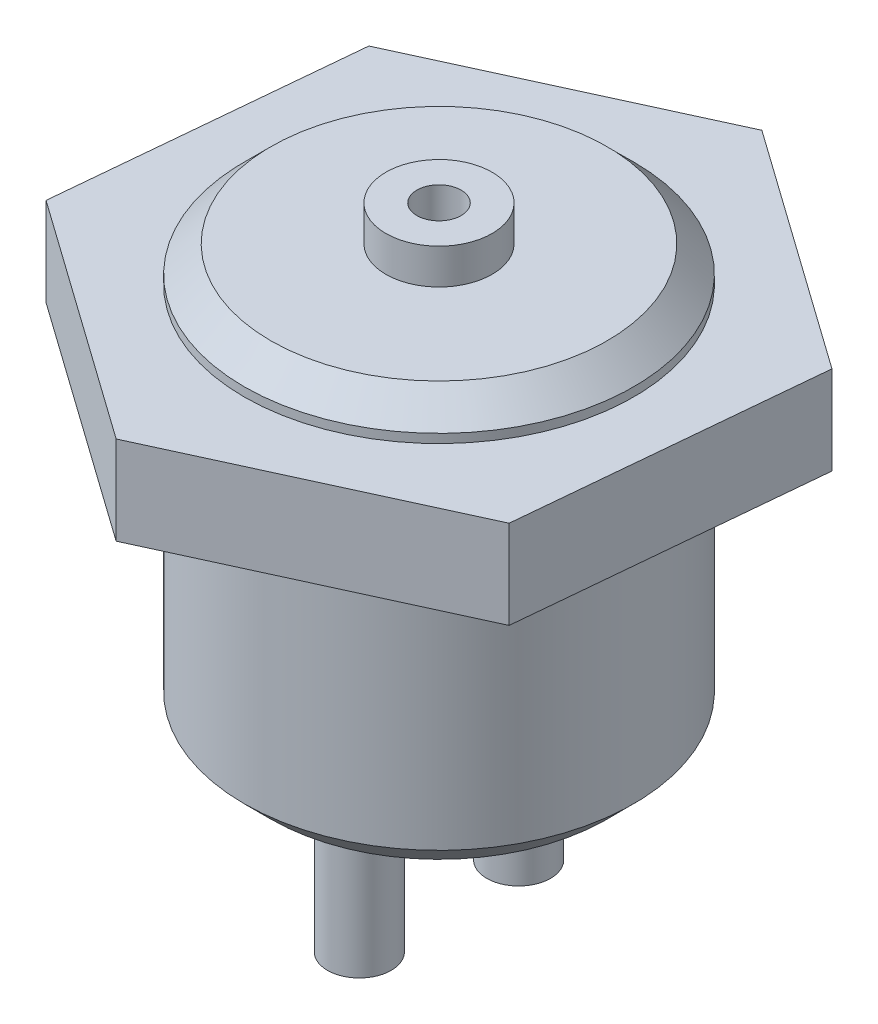
ISO-10303-21;
HEADER;
FILE_DESCRIPTION(('STEP AP214'),'2;1');
FILE_NAME('part.step','',(''),(''),'','','');
FILE_SCHEMA(('AUTOMOTIVE_DESIGN { 1 0 10303 214 1 1 1 1 }'));
ENDSEC;
DATA;
#1=APPLICATION_CONTEXT('core data for automotive mechanical design processes');
#2=APPLICATION_PROTOCOL_DEFINITION('international standard','automotive_design',2000,#1);
#3=PRODUCT_CONTEXT('',#1,'mechanical');
#4=PRODUCT('Part','Part','',(#3));
#5=PRODUCT_RELATED_PRODUCT_CATEGORY('part','',(#4));
#6=PRODUCT_DEFINITION_FORMATION('','',#4);
#7=PRODUCT_DEFINITION_CONTEXT('part definition',#1,'design');
#8=PRODUCT_DEFINITION('design','',#6,#7);
#9=PRODUCT_DEFINITION_SHAPE('','',#8);
#10=(LENGTH_UNIT() NAMED_UNIT(*) SI_UNIT(.MILLI.,.METRE.));
#11=(NAMED_UNIT(*) PLANE_ANGLE_UNIT() SI_UNIT($,.RADIAN.));
#12=(NAMED_UNIT(*) SI_UNIT($,.STERADIAN.) SOLID_ANGLE_UNIT());
#13=UNCERTAINTY_MEASURE_WITH_UNIT(LENGTH_MEASURE(1.E-05),#10,'distance_accuracy_value','');
#14=(GEOMETRIC_REPRESENTATION_CONTEXT(3) GLOBAL_UNCERTAINTY_ASSIGNED_CONTEXT((#13)) GLOBAL_UNIT_ASSIGNED_CONTEXT((#10,
#11,#12)) REPRESENTATION_CONTEXT('',''));
#15=CARTESIAN_POINT('',(0.,0.,0.));
#16=DIRECTION('',(0.,0.,1.));
#17=DIRECTION('',(1.,0.,0.));
#18=AXIS2_PLACEMENT_3D('',#15,#16,#17);
#19=CARTESIAN_POINT('',(0.,23.4,0.));
#20=DIRECTION('',(0.,-1.,0.));
#21=DIRECTION('',(0.,0.,-1.));
#22=AXIS2_PLACEMENT_3D('',#19,#20,#21);
#23=CYLINDRICAL_SURFACE('',#22,11.);
#24=CARTESIAN_POINT('',(0.,1.5,0.));
#25=DIRECTION('',(0.,1.,0.));
#26=DIRECTION('',(0.,0.,1.));
#27=AXIS2_PLACEMENT_3D('',#24,#25,#26);
#28=CIRCLE('',#27,11.);
#29=CARTESIAN_POINT('',(0.,1.5,11.));
#30=VERTEX_POINT('',#29);
#31=EDGE_CURVE('E166',#30,#30,#28,.T.);
#32=ORIENTED_EDGE('',*,*,#31,.T.);
#33=EDGE_LOOP('',(#32));
#34=FACE_BOUND('',#33,.T.);
#35=CARTESIAN_POINT('',(0.,16.4,0.));
#36=DIRECTION('',(0.,1.,0.));
#37=DIRECTION('',(0.,0.,1.));
#38=AXIS2_PLACEMENT_3D('',#35,#36,#37);
#39=CIRCLE('',#38,11.);
#40=CARTESIAN_POINT('',(0.,16.4,11.));
#41=VERTEX_POINT('',#40);
#42=EDGE_CURVE('E11',#41,#41,#39,.T.);
#43=ORIENTED_EDGE('',*,*,#42,.F.);
#44=EDGE_LOOP('',(#43));
#45=FACE_BOUND('',#44,.T.);
#46=ADVANCED_FACE('F35',(#34,#45),#23,.T.);
#47=CARTESIAN_POINT('',(0.,0.,0.));
#48=DIRECTION('',(0.,1.,0.));
#49=DIRECTION('',(0.,0.,1.));
#50=AXIS2_PLACEMENT_3D('',#47,#48,#49);
#51=PLANE('',#50);
#52=CARTESIAN_POINT('',(0.,0.,4.5));
#53=DIRECTION('',(0.,1.,0.));
#54=DIRECTION('',(0.,0.,1.));
#55=AXIS2_PLACEMENT_3D('',#52,#53,#54);
#56=CIRCLE('',#55,1.8);
#57=CARTESIAN_POINT('',(0.,0.,6.3));
#58=VERTEX_POINT('',#57);
#59=EDGE_CURVE('E172',#58,#58,#56,.F.);
#60=ORIENTED_EDGE('',*,*,#59,.F.);
#61=EDGE_LOOP('',(#60));
#62=FACE_BOUND('',#61,.T.);
#63=CARTESIAN_POINT('',(0.,0.,0.));
#64=DIRECTION('',(0.,1.,0.));
#65=DIRECTION('',(0.,0.,1.));
#66=AXIS2_PLACEMENT_3D('',#63,#64,#65);
#67=CIRCLE('',#66,9.49999999999999);
#68=CARTESIAN_POINT('',(0.,0.,9.49999999999999));
#69=VERTEX_POINT('',#68);
#70=EDGE_CURVE('E169',#69,#69,#67,.F.);
#71=ORIENTED_EDGE('',*,*,#70,.T.);
#72=EDGE_LOOP('',(#71));
#73=FACE_BOUND('',#72,.T.);
#74=CARTESIAN_POINT('',(0.,0.,-4.5));
#75=DIRECTION('',(0.,1.,0.));
#76=DIRECTION('',(0.,0.,1.));
#77=AXIS2_PLACEMENT_3D('',#74,#75,#76);
#78=CIRCLE('',#77,1.8);
#79=CARTESIAN_POINT('',(0.,0.,-2.7));
#80=VERTEX_POINT('',#79);
#81=EDGE_CURVE('E44',#80,#80,#78,.F.);
#82=ORIENTED_EDGE('',*,*,#81,.F.);
#83=EDGE_LOOP('',(#82));
#84=FACE_BOUND('',#83,.T.);
#85=ADVANCED_FACE('F197',(#62,#73,#84),#51,.F.);
#86=CARTESIAN_POINT('',(0.,1.5,0.));
#87=DIRECTION('',(0.,1.,0.));
#88=DIRECTION('',(0.,0.,1.));
#89=AXIS2_PLACEMENT_3D('',#86,#87,#88);
#90=CONICAL_SURFACE('',#89,11.,0.78539816339745);
#91=ORIENTED_EDGE('',*,*,#70,.F.);
#92=EDGE_LOOP('',(#91));
#93=FACE_BOUND('',#92,.T.);
#94=ORIENTED_EDGE('',*,*,#31,.F.);
#95=EDGE_LOOP('',(#94));
#96=FACE_BOUND('',#95,.T.);
#97=ADVANCED_FACE('F37',(#93,#96),#90,.T.);
#98=CARTESIAN_POINT('',(0.,-9.,4.5));
#99=DIRECTION('',(0.,1.,0.));
#100=DIRECTION('',(0.,0.,1.));
#101=AXIS2_PLACEMENT_3D('',#98,#99,#100);
#102=CYLINDRICAL_SURFACE('',#101,1.8);
#103=CARTESIAN_POINT('',(0.,-9.,4.5));
#104=DIRECTION('',(0.,-1.,0.));
#105=DIRECTION('',(0.,0.,-1.));
#106=AXIS2_PLACEMENT_3D('',#103,#104,#105);
#107=CIRCLE('',#106,1.8);
#108=CARTESIAN_POINT('',(0.,-9.,2.7));
#109=VERTEX_POINT('',#108);
#110=EDGE_CURVE('E148',#109,#109,#107,.T.);
#111=ORIENTED_EDGE('',*,*,#110,.F.);
#112=EDGE_LOOP('',(#111));
#113=FACE_BOUND('',#112,.T.);
#114=ORIENTED_EDGE('',*,*,#59,.T.);
#115=EDGE_LOOP('',(#114));
#116=FACE_BOUND('',#115,.T.);
#117=ADVANCED_FACE('F236',(#113,#116),#102,.T.);
#118=CARTESIAN_POINT('',(0.,-9.,4.5));
#119=DIRECTION('',(0.,-1.,0.));
#120=DIRECTION('',(0.,0.,-1.));
#121=AXIS2_PLACEMENT_3D('',#118,#119,#120);
#122=PLANE('',#121);
#123=ORIENTED_EDGE('',*,*,#110,.T.);
#124=EDGE_LOOP('',(#123));
#125=FACE_BOUND('',#124,.T.);
#126=ADVANCED_FACE('F239',(#125),#122,.T.);
#127=CARTESIAN_POINT('',(0.,-9.,-4.5));
#128=DIRECTION('',(0.,1.,0.));
#129=DIRECTION('',(0.,0.,1.));
#130=AXIS2_PLACEMENT_3D('',#127,#128,#129);
#131=CYLINDRICAL_SURFACE('',#130,1.8);
#132=CARTESIAN_POINT('',(0.,-9.,-4.5));
#133=DIRECTION('',(0.,-1.,0.));
#134=DIRECTION('',(0.,0.,1.));
#135=AXIS2_PLACEMENT_3D('',#132,#133,#134);
#136=CIRCLE('',#135,1.8);
#137=CARTESIAN_POINT('',(0.,-9.,-2.7));
#138=VERTEX_POINT('',#137);
#139=EDGE_CURVE('E145',#138,#138,#136,.T.);
#140=ORIENTED_EDGE('',*,*,#139,.F.);
#141=EDGE_LOOP('',(#140));
#142=FACE_BOUND('',#141,.T.);
#143=ORIENTED_EDGE('',*,*,#81,.T.);
#144=EDGE_LOOP('',(#143));
#145=FACE_BOUND('',#144,.T.);
#146=ADVANCED_FACE('F243',(#142,#145),#131,.T.);
#147=CARTESIAN_POINT('',(0.,-9.,-4.5));
#148=DIRECTION('',(0.,1.,0.));
#149=DIRECTION('',(0.,0.,1.));
#150=AXIS2_PLACEMENT_3D('',#147,#148,#149);
#151=PLANE('',#150);
#152=ORIENTED_EDGE('',*,*,#139,.T.);
#153=EDGE_LOOP('',(#152));
#154=FACE_BOUND('',#153,.T.);
#155=ADVANCED_FACE('F247',(#154),#151,.F.);
#156=CARTESIAN_POINT('',(-13.6527151421947,16.4,-9.69209484989809));
#157=DIRECTION('',(0.,1.,0.));
#158=DIRECTION('',(0.,0.,1.));
#159=AXIS2_PLACEMENT_3D('',#156,#157,#158);
#160=PLANE('',#159);
#161=DIRECTION('',(-0.909025531676559,0.,0.416740426116964));
#162=VECTOR('',#161,1.);
#163=CARTESIAN_POINT('',(1.56724278480273,16.4,-16.6696455687221));
#164=LINE('',#163,#162);
#165=CARTESIAN_POINT('',(1.56724278480273,16.4,-16.6696455687221));
#166=VERTEX_POINT('',#165);
#167=CARTESIAN_POINT('',(-13.6527151421947,16.4,-9.69209484989809));
#168=VERTEX_POINT('',#167);
#169=EDGE_CURVE('E122',#166,#168,#164,.T.);
#170=ORIENTED_EDGE('',*,*,#169,.F.);
#171=DIRECTION('',(-0.815420561639522,0.,-0.578868990062074));
#172=VECTOR('',#171,1.);
#173=CARTESIAN_POINT('',(15.2199579269974,16.4,-6.97755071882403));
#174=LINE('',#173,#172);
#175=CARTESIAN_POINT('',(15.2199579269974,16.4,-6.97755071882403));
#176=VERTEX_POINT('',#175);
#177=EDGE_CURVE('E81',#176,#166,#174,.T.);
#178=ORIENTED_EDGE('',*,*,#177,.F.);
#179=DIRECTION('',(0.0936049700370366,0.,-0.995609416179038));
#180=VECTOR('',#179,1.);
#181=CARTESIAN_POINT('',(13.6527151421947,16.4,9.6920948498981));
#182=LINE('',#181,#180);
#183=CARTESIAN_POINT('',(13.6527151421947,16.4,9.6920948498981));
#184=VERTEX_POINT('',#183);
#185=EDGE_CURVE('E75',#184,#176,#182,.T.);
#186=ORIENTED_EDGE('',*,*,#185,.F.);
#187=DIRECTION('',(0.909025531676559,0.,-0.416740426116964));
#188=VECTOR('',#187,1.);
#189=CARTESIAN_POINT('',(-1.56724278480273,16.4,16.6696455687221));
#190=LINE('',#189,#188);
#191=CARTESIAN_POINT('',(-1.56724278480273,16.4,16.6696455687221));
#192=VERTEX_POINT('',#191);
#193=EDGE_CURVE('E112',#192,#184,#190,.T.);
#194=ORIENTED_EDGE('',*,*,#193,.F.);
#195=DIRECTION('',(0.815420561639522,0.,0.578868990062074));
#196=VECTOR('',#195,1.);
#197=CARTESIAN_POINT('',(-15.2199579269974,16.4,6.97755071882403));
#198=LINE('',#197,#196);
#199=CARTESIAN_POINT('',(-15.2199579269974,16.4,6.97755071882403));
#200=VERTEX_POINT('',#199);
#201=EDGE_CURVE('E127',#200,#192,#198,.T.);
#202=ORIENTED_EDGE('',*,*,#201,.F.);
#203=DIRECTION('',(-0.0936049700370367,0.,0.995609416179038));
#204=VECTOR('',#203,1.);
#205=CARTESIAN_POINT('',(-13.6527151421947,16.4,-9.69209484989809));
#206=LINE('',#205,#204);
#207=EDGE_CURVE('E125',#168,#200,#206,.T.);
#208=ORIENTED_EDGE('',*,*,#207,.F.);
#209=EDGE_LOOP('',(#170,#178,#186,#194,#202,#208));
#210=FACE_BOUND('',#209,.T.);
#211=ORIENTED_EDGE('',*,*,#42,.T.);
#212=EDGE_LOOP('',(#211));
#213=FACE_BOUND('',#212,.T.);
#214=ADVANCED_FACE('F195',(#210,#213),#160,.F.);
#215=CARTESIAN_POINT('',(-13.6527151421947,21.4,-9.69209484989809));
#216=DIRECTION('',(0.,1.,0.));
#217=DIRECTION('',(0.,0.,1.));
#218=AXIS2_PLACEMENT_3D('',#215,#216,#217);
#219=PLANE('',#218);
#220=DIRECTION('',(-0.909025531676559,0.,0.416740426116964));
#221=VECTOR('',#220,1.);
#222=CARTESIAN_POINT('',(1.56724278480273,21.4,-16.6696455687221));
#223=LINE('',#222,#221);
#224=CARTESIAN_POINT('',(1.56724278480273,21.4,-16.6696455687221));
#225=VERTEX_POINT('',#224);
#226=CARTESIAN_POINT('',(-13.6527151421947,21.4,-9.69209484989809));
#227=VERTEX_POINT('',#226);
#228=EDGE_CURVE('E132',#225,#227,#223,.T.);
#229=ORIENTED_EDGE('',*,*,#228,.T.);
#230=DIRECTION('',(-0.0936049700370367,0.,0.995609416179038));
#231=VECTOR('',#230,1.);
#232=CARTESIAN_POINT('',(-13.6527151421947,21.4,-9.69209484989809));
#233=LINE('',#232,#231);
#234=CARTESIAN_POINT('',(-15.2199579269974,21.4,6.97755071882403));
#235=VERTEX_POINT('',#234);
#236=EDGE_CURVE('E90',#227,#235,#233,.T.);
#237=ORIENTED_EDGE('',*,*,#236,.T.);
#238=DIRECTION('',(0.815420561639522,0.,0.578868990062074));
#239=VECTOR('',#238,1.);
#240=CARTESIAN_POINT('',(-15.2199579269974,21.4,6.97755071882403));
#241=LINE('',#240,#239);
#242=CARTESIAN_POINT('',(-1.56724278480273,21.4,16.6696455687221));
#243=VERTEX_POINT('',#242);
#244=EDGE_CURVE('E104',#235,#243,#241,.T.);
#245=ORIENTED_EDGE('',*,*,#244,.T.);
#246=DIRECTION('',(0.909025531676559,0.,-0.416740426116964));
#247=VECTOR('',#246,1.);
#248=CARTESIAN_POINT('',(-1.56724278480273,21.4,16.6696455687221));
#249=LINE('',#248,#247);
#250=CARTESIAN_POINT('',(13.6527151421947,21.4,9.6920948498981));
#251=VERTEX_POINT('',#250);
#252=EDGE_CURVE('E97',#243,#251,#249,.T.);
#253=ORIENTED_EDGE('',*,*,#252,.T.);
#254=DIRECTION('',(0.0936049700370366,0.,-0.995609416179038));
#255=VECTOR('',#254,1.);
#256=CARTESIAN_POINT('',(13.6527151421947,21.4,9.6920948498981));
#257=LINE('',#256,#255);
#258=CARTESIAN_POINT('',(15.2199579269974,21.4,-6.97755071882403));
#259=VERTEX_POINT('',#258);
#260=EDGE_CURVE('E102',#251,#259,#257,.T.);
#261=ORIENTED_EDGE('',*,*,#260,.T.);
#262=DIRECTION('',(-0.815420561639522,0.,-0.578868990062074));
#263=VECTOR('',#262,1.);
#264=CARTESIAN_POINT('',(15.2199579269974,21.4,-6.97755071882403));
#265=LINE('',#264,#263);
#266=EDGE_CURVE('E52',#259,#225,#265,.T.);
#267=ORIENTED_EDGE('',*,*,#266,.T.);
#268=EDGE_LOOP('',(#229,#237,#245,#253,#261,#267));
#269=FACE_BOUND('',#268,.T.);
#270=CARTESIAN_POINT('',(0.,21.4,0.));
#271=DIRECTION('',(0.,1.,0.));
#272=DIRECTION('',(0.,0.,1.));
#273=AXIS2_PLACEMENT_3D('',#270,#271,#272);
#274=CIRCLE('',#273,11.);
#275=CARTESIAN_POINT('',(0.,21.4,11.));
#276=VERTEX_POINT('',#275);
#277=EDGE_CURVE('E142',#276,#276,#274,.T.);
#278=ORIENTED_EDGE('',*,*,#277,.F.);
#279=EDGE_LOOP('',(#278));
#280=FACE_BOUND('',#279,.T.);
#281=ADVANCED_FACE('F99',(#269,#280),#219,.T.);
#282=CARTESIAN_POINT('',(1.56724278480273,21.4,-16.6696455687221));
#283=DIRECTION('',(0.416740426116964,0.,0.909025531676559));
#284=DIRECTION('',(0.909025531676559,0.,-0.416740426116964));
#285=AXIS2_PLACEMENT_3D('',#282,#283,#284);
#286=PLANE('',#285);
#287=ORIENTED_EDGE('',*,*,#169,.T.);
#288=DIRECTION('',(0.,-1.,0.));
#289=VECTOR('',#288,1.);
#290=CARTESIAN_POINT('',(-13.6527151421947,21.4,-9.69209484989809));
#291=LINE('',#290,#289);
#292=EDGE_CURVE('E139',#227,#168,#291,.T.);
#293=ORIENTED_EDGE('',*,*,#292,.F.);
#294=ORIENTED_EDGE('',*,*,#228,.F.);
#295=DIRECTION('',(0.,-1.,0.));
#296=VECTOR('',#295,1.);
#297=CARTESIAN_POINT('',(1.56724278480273,21.4,-16.6696455687221));
#298=LINE('',#297,#296);
#299=EDGE_CURVE('E118',#225,#166,#298,.T.);
#300=ORIENTED_EDGE('',*,*,#299,.T.);
#301=EDGE_LOOP('',(#287,#293,#294,#300));
#302=FACE_BOUND('',#301,.T.);
#303=ADVANCED_FACE('F194',(#302),#286,.F.);
#304=CARTESIAN_POINT('',(-13.6527151421947,21.4,-9.69209484989809));
#305=DIRECTION('',(0.995609416179038,0.,0.0936049700370367));
#306=DIRECTION('',(0.0936049700370367,0.,-0.995609416179038));
#307=AXIS2_PLACEMENT_3D('',#304,#305,#306);
#308=PLANE('',#307);
#309=ORIENTED_EDGE('',*,*,#207,.T.);
#310=DIRECTION('',(0.,-1.,0.));
#311=VECTOR('',#310,1.);
#312=CARTESIAN_POINT('',(-15.2199579269974,21.4,6.97755071882403));
#313=LINE('',#312,#311);
#314=EDGE_CURVE('E136',#235,#200,#313,.T.);
#315=ORIENTED_EDGE('',*,*,#314,.F.);
#316=ORIENTED_EDGE('',*,*,#236,.F.);
#317=ORIENTED_EDGE('',*,*,#292,.T.);
#318=EDGE_LOOP('',(#309,#315,#316,#317));
#319=FACE_BOUND('',#318,.T.);
#320=ADVANCED_FACE('F254',(#319),#308,.F.);
#321=CARTESIAN_POINT('',(-15.2199579269974,21.4,6.97755071882403));
#322=DIRECTION('',(0.578868990062074,0.,-0.815420561639522));
#323=DIRECTION('',(-0.815420561639522,0.,-0.578868990062074));
#324=AXIS2_PLACEMENT_3D('',#321,#322,#323);
#325=PLANE('',#324);
#326=ORIENTED_EDGE('',*,*,#201,.T.);
#327=DIRECTION('',(0.,-1.,0.));
#328=VECTOR('',#327,1.);
#329=CARTESIAN_POINT('',(-1.56724278480273,21.4,16.6696455687221));
#330=LINE('',#329,#328);
#331=EDGE_CURVE('E113',#243,#192,#330,.T.);
#332=ORIENTED_EDGE('',*,*,#331,.F.);
#333=ORIENTED_EDGE('',*,*,#244,.F.);
#334=ORIENTED_EDGE('',*,*,#314,.T.);
#335=EDGE_LOOP('',(#326,#332,#333,#334));
#336=FACE_BOUND('',#335,.T.);
#337=ADVANCED_FACE('F258',(#336),#325,.F.);
#338=CARTESIAN_POINT('',(-1.56724278480273,21.4,16.6696455687221));
#339=DIRECTION('',(-0.416740426116964,0.,-0.909025531676559));
#340=DIRECTION('',(-0.909025531676559,0.,0.416740426116964));
#341=AXIS2_PLACEMENT_3D('',#338,#339,#340);
#342=PLANE('',#341);
#343=ORIENTED_EDGE('',*,*,#193,.T.);
#344=DIRECTION('',(0.,-1.,0.));
#345=VECTOR('',#344,1.);
#346=CARTESIAN_POINT('',(13.6527151421947,21.4,9.6920948498981));
#347=LINE('',#346,#345);
#348=EDGE_CURVE('E109',#251,#184,#347,.T.);
#349=ORIENTED_EDGE('',*,*,#348,.F.);
#350=ORIENTED_EDGE('',*,*,#252,.F.);
#351=ORIENTED_EDGE('',*,*,#331,.T.);
#352=EDGE_LOOP('',(#343,#349,#350,#351));
#353=FACE_BOUND('',#352,.T.);
#354=ADVANCED_FACE('F110',(#353),#342,.F.);
#355=CARTESIAN_POINT('',(13.6527151421947,21.4,9.6920948498981));
#356=DIRECTION('',(-0.995609416179038,0.,-0.0936049700370366));
#357=DIRECTION('',(-0.0936049700370366,0.,0.995609416179038));
#358=AXIS2_PLACEMENT_3D('',#355,#356,#357);
#359=PLANE('',#358);
#360=ORIENTED_EDGE('',*,*,#185,.T.);
#361=DIRECTION('',(0.,-1.,0.));
#362=VECTOR('',#361,1.);
#363=CARTESIAN_POINT('',(15.2199579269974,21.4,-6.97755071882403));
#364=LINE('',#363,#362);
#365=EDGE_CURVE('E114',#259,#176,#364,.T.);
#366=ORIENTED_EDGE('',*,*,#365,.F.);
#367=ORIENTED_EDGE('',*,*,#260,.F.);
#368=ORIENTED_EDGE('',*,*,#348,.T.);
#369=EDGE_LOOP('',(#360,#366,#367,#368));
#370=FACE_BOUND('',#369,.T.);
#371=ADVANCED_FACE('F116',(#370),#359,.F.);
#372=CARTESIAN_POINT('',(15.2199579269974,21.4,-6.97755071882403));
#373=DIRECTION('',(-0.578868990062074,0.,0.815420561639522));
#374=DIRECTION('',(0.815420561639522,0.,0.578868990062074));
#375=AXIS2_PLACEMENT_3D('',#372,#373,#374);
#376=PLANE('',#375);
#377=ORIENTED_EDGE('',*,*,#177,.T.);
#378=ORIENTED_EDGE('',*,*,#299,.F.);
#379=ORIENTED_EDGE('',*,*,#266,.F.);
#380=ORIENTED_EDGE('',*,*,#365,.T.);
#381=EDGE_LOOP('',(#377,#378,#379,#380));
#382=FACE_BOUND('',#381,.T.);
#383=ADVANCED_FACE('F222',(#382),#376,.F.);
#384=CARTESIAN_POINT('',(0.,25.4,0.));
#385=DIRECTION('',(0.,-1.,0.));
#386=DIRECTION('',(0.,0.,-1.));
#387=AXIS2_PLACEMENT_3D('',#384,#385,#386);
#388=CYLINDRICAL_SURFACE('',#387,3.);
#389=CARTESIAN_POINT('',(0.,25.4,0.));
#390=DIRECTION('',(0.,1.,0.));
#391=DIRECTION('',(0.,0.,1.));
#392=AXIS2_PLACEMENT_3D('',#389,#390,#391);
#393=CIRCLE('',#392,3.);
#394=CARTESIAN_POINT('',(0.,25.4,3.));
#395=VERTEX_POINT('',#394);
#396=EDGE_CURVE('E155',#395,#395,#393,.T.);
#397=ORIENTED_EDGE('',*,*,#396,.F.);
#398=EDGE_LOOP('',(#397));
#399=FACE_BOUND('',#398,.T.);
#400=CARTESIAN_POINT('',(0.,23.4,0.));
#401=DIRECTION('',(0.,1.,0.));
#402=DIRECTION('',(0.,0.,1.));
#403=AXIS2_PLACEMENT_3D('',#400,#401,#402);
#404=CIRCLE('',#403,3.);
#405=CARTESIAN_POINT('',(0.,23.4,3.));
#406=VERTEX_POINT('',#405);
#407=EDGE_CURVE('E154',#406,#406,#404,.T.);
#408=ORIENTED_EDGE('',*,*,#407,.T.);
#409=EDGE_LOOP('',(#408));
#410=FACE_BOUND('',#409,.T.);
#411=ADVANCED_FACE('F219',(#399,#410),#388,.T.);
#412=CARTESIAN_POINT('',(0.,25.4,0.));
#413=DIRECTION('',(0.,1.,0.));
#414=DIRECTION('',(0.,0.,1.));
#415=AXIS2_PLACEMENT_3D('',#412,#413,#414);
#416=PLANE('',#415);
#417=CARTESIAN_POINT('',(0.,25.4,0.));
#418=DIRECTION('',(0.,1.,0.));
#419=DIRECTION('',(0.,0.,1.));
#420=AXIS2_PLACEMENT_3D('',#417,#418,#419);
#421=CIRCLE('',#420,1.25);
#422=CARTESIAN_POINT('',(0.,25.4,1.25));
#423=VERTEX_POINT('',#422);
#424=EDGE_CURVE('E151',#423,#423,#421,.T.);
#425=ORIENTED_EDGE('',*,*,#424,.F.);
#426=EDGE_LOOP('',(#425));
#427=FACE_BOUND('',#426,.T.);
#428=ORIENTED_EDGE('',*,*,#396,.T.);
#429=EDGE_LOOP('',(#428));
#430=FACE_BOUND('',#429,.T.);
#431=ADVANCED_FACE('F221',(#427,#430),#416,.T.);
#432=CARTESIAN_POINT('',(0.,25.4,0.));
#433=DIRECTION('',(0.,1.,0.));
#434=DIRECTION('',(0.,0.,1.));
#435=AXIS2_PLACEMENT_3D('',#432,#433,#434);
#436=CYLINDRICAL_SURFACE('',#435,1.25);
#437=CARTESIAN_POINT('',(0.,21.4,0.));
#438=DIRECTION('',(0.,1.,0.));
#439=DIRECTION('',(0.,0.,1.));
#440=AXIS2_PLACEMENT_3D('',#437,#438,#439);
#441=CIRCLE('',#440,1.25);
#442=CARTESIAN_POINT('',(0.,21.4,1.25));
#443=VERTEX_POINT('',#442);
#444=EDGE_CURVE('E141',#443,#443,#441,.F.);
#445=ORIENTED_EDGE('',*,*,#444,.T.);
#446=EDGE_LOOP('',(#445));
#447=FACE_BOUND('',#446,.T.);
#448=ORIENTED_EDGE('',*,*,#424,.T.);
#449=EDGE_LOOP('',(#448));
#450=FACE_BOUND('',#449,.T.);
#451=ADVANCED_FACE('F179',(#447,#450),#436,.F.);
#452=CARTESIAN_POINT('',(0.,23.4,0.));
#453=DIRECTION('',(0.,1.,0.));
#454=DIRECTION('',(0.,0.,1.));
#455=AXIS2_PLACEMENT_3D('',#452,#453,#454);
#456=PLANE('',#455);
#457=CARTESIAN_POINT('',(0.,23.4,0.));
#458=DIRECTION('',(0.,1.,0.));
#459=DIRECTION('',(0.,0.,1.));
#460=AXIS2_PLACEMENT_3D('',#457,#458,#459);
#461=CIRCLE('',#460,9.50000000000001);
#462=CARTESIAN_POINT('',(0.,23.4,9.50000000000001));
#463=VERTEX_POINT('',#462);
#464=EDGE_CURVE('E158',#463,#463,#461,.T.);
#465=ORIENTED_EDGE('',*,*,#464,.T.);
#466=EDGE_LOOP('',(#465));
#467=FACE_BOUND('',#466,.T.);
#468=ORIENTED_EDGE('',*,*,#407,.F.);
#469=EDGE_LOOP('',(#468));
#470=FACE_BOUND('',#469,.T.);
#471=ADVANCED_FACE('F207',(#467,#470),#456,.T.);
#472=CARTESIAN_POINT('',(0.,23.4,0.));
#473=DIRECTION('',(0.,-1.,0.));
#474=DIRECTION('',(0.,0.,-1.));
#475=AXIS2_PLACEMENT_3D('',#472,#473,#474);
#476=CONICAL_SURFACE('',#475,9.50000000000001,0.785398163397443);
#477=CARTESIAN_POINT('',(0.,21.9,0.));
#478=DIRECTION('',(0.,1.,0.));
#479=DIRECTION('',(0.,0.,1.));
#480=AXIS2_PLACEMENT_3D('',#477,#478,#479);
#481=CIRCLE('',#480,11.);
#482=CARTESIAN_POINT('',(0.,21.9,11.));
#483=VERTEX_POINT('',#482);
#484=EDGE_CURVE('E163',#483,#483,#481,.F.);
#485=ORIENTED_EDGE('',*,*,#484,.F.);
#486=EDGE_LOOP('',(#485));
#487=FACE_BOUND('',#486,.T.);
#488=ORIENTED_EDGE('',*,*,#464,.F.);
#489=EDGE_LOOP('',(#488));
#490=FACE_BOUND('',#489,.T.);
#491=ADVANCED_FACE('F189',(#487,#490),#476,.T.);
#492=ORIENTED_EDGE('',*,*,#277,.T.);
#493=EDGE_LOOP('',(#492));
#494=FACE_BOUND('',#493,.T.);
#495=ORIENTED_EDGE('',*,*,#484,.T.);
#496=EDGE_LOOP('',(#495));
#497=FACE_BOUND('',#496,.T.);
#498=ADVANCED_FACE('F184',(#494,#497),#23,.T.);
#499=ORIENTED_EDGE('',*,*,#444,.F.);
#500=EDGE_LOOP('',(#499));
#501=FACE_BOUND('',#500,.T.);
#502=ADVANCED_FACE('F182',(#501),#219,.T.);
#503=CLOSED_SHELL('',(#46,#85,#97,#117,#126,#146,#155,#214,#281,#303,#320,#337,#354,#371,#383,
#411,#431,#451,#471,#491,#498,#502));
#504=MANIFOLD_SOLID_BREP('B2',#503);
#505=ADVANCED_BREP_SHAPE_REPRESENTATION('',(#18,#504),#14);
#506=SHAPE_DEFINITION_REPRESENTATION(#9,#505);
ENDSEC;
END-ISO-10303-21;
